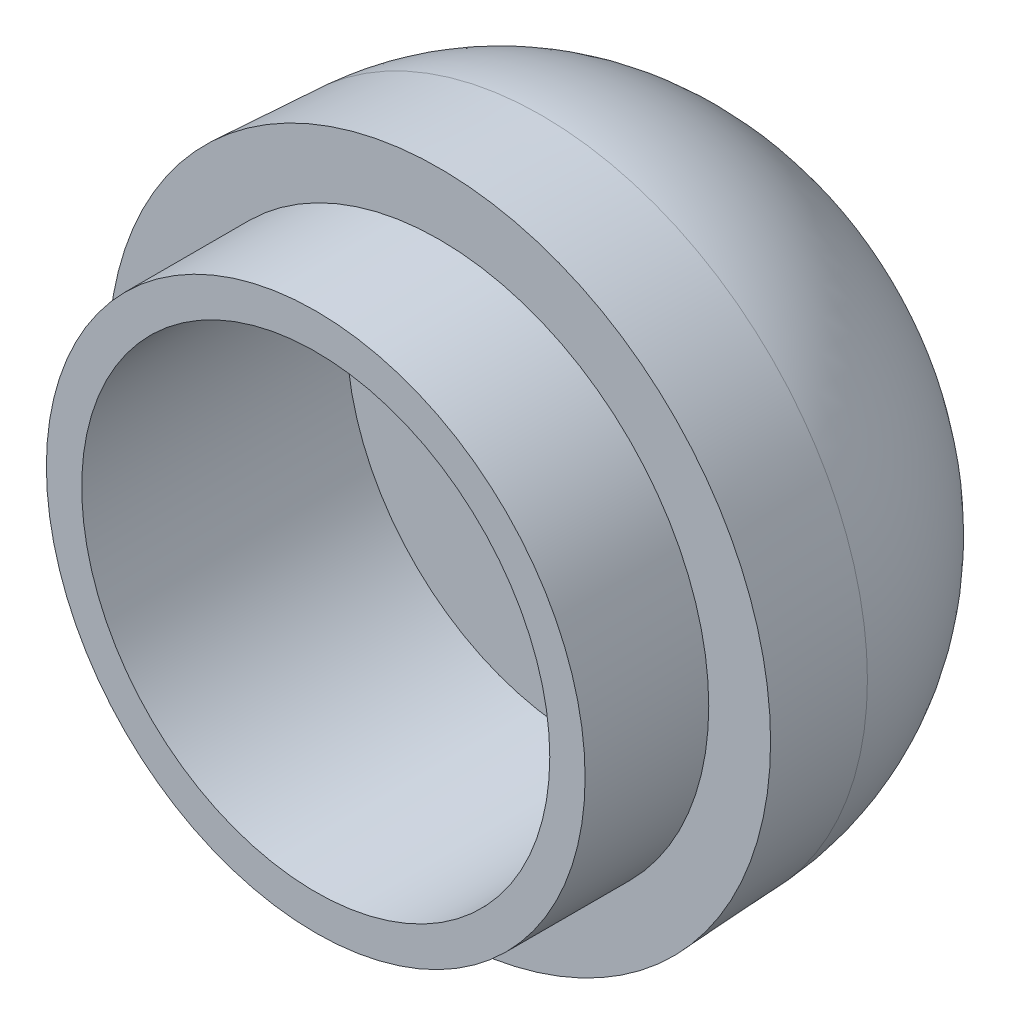
ISO-10303-21;
HEADER;
FILE_DESCRIPTION(('STEP AP214'),'2;1');
FILE_NAME('part.step','',(''),(''),'','','');
FILE_SCHEMA(('AUTOMOTIVE_DESIGN { 1 0 10303 214 1 1 1 1 }'));
ENDSEC;
DATA;
#1=APPLICATION_CONTEXT('core data for automotive mechanical design processes');
#2=APPLICATION_PROTOCOL_DEFINITION('international standard','automotive_design',2000,#1);
#3=PRODUCT_CONTEXT('',#1,'mechanical');
#4=PRODUCT('Part','Part','',(#3));
#5=PRODUCT_RELATED_PRODUCT_CATEGORY('part','',(#4));
#6=PRODUCT_DEFINITION_FORMATION('','',#4);
#7=PRODUCT_DEFINITION_CONTEXT('part definition',#1,'design');
#8=PRODUCT_DEFINITION('design','',#6,#7);
#9=PRODUCT_DEFINITION_SHAPE('','',#8);
#10=(LENGTH_UNIT() NAMED_UNIT(*) SI_UNIT(.MILLI.,.METRE.));
#11=(NAMED_UNIT(*) PLANE_ANGLE_UNIT() SI_UNIT($,.RADIAN.));
#12=(NAMED_UNIT(*) SI_UNIT($,.STERADIAN.) SOLID_ANGLE_UNIT());
#13=UNCERTAINTY_MEASURE_WITH_UNIT(LENGTH_MEASURE(1.E-05),#10,'distance_accuracy_value','');
#14=(GEOMETRIC_REPRESENTATION_CONTEXT(3) GLOBAL_UNCERTAINTY_ASSIGNED_CONTEXT((#13)) GLOBAL_UNIT_ASSIGNED_CONTEXT((#10,
#11,#12)) REPRESENTATION_CONTEXT('',''));
#15=CARTESIAN_POINT('',(0.,0.,0.));
#16=DIRECTION('',(0.,0.,1.));
#17=DIRECTION('',(1.,0.,0.));
#18=AXIS2_PLACEMENT_3D('',#15,#16,#17);
#19=CARTESIAN_POINT('',(0.,0.,0.));
#20=DIRECTION('',(0.,0.,1.));
#21=DIRECTION('',(1.,0.,0.));
#22=AXIS2_PLACEMENT_3D('',#19,#20,#21);
#23=PLANE('',#22);
#24=CARTESIAN_POINT('',(0.,0.,0.));
#25=DIRECTION('',(0.,0.,1.));
#26=DIRECTION('',(1.,0.,0.));
#27=AXIS2_PLACEMENT_3D('',#24,#25,#26);
#28=CIRCLE('',#27,4.7625);
#29=CARTESIAN_POINT('',(4.7625,0.,0.));
#30=VERTEX_POINT('',#29);
#31=EDGE_CURVE('E43',#30,#30,#28,.T.);
#32=ORIENTED_EDGE('',*,*,#31,.T.);
#33=EDGE_LOOP('',(#32));
#34=FACE_BOUND('',#33,.T.);
#35=CARTESIAN_POINT('',(0.,0.,0.));
#36=DIRECTION('',(0.,0.,1.));
#37=DIRECTION('',(1.,0.,0.));
#38=AXIS2_PLACEMENT_3D('',#35,#36,#37);
#39=CIRCLE('',#38,3.8735);
#40=CARTESIAN_POINT('',(3.8735,0.,0.));
#41=VERTEX_POINT('',#40);
#42=EDGE_CURVE('E50',#41,#41,#39,.T.);
#43=ORIENTED_EDGE('',*,*,#42,.F.);
#44=EDGE_LOOP('',(#43));
#45=FACE_BOUND('',#44,.T.);
#46=ADVANCED_FACE('F32',(#34,#45),#23,.T.);
#47=CARTESIAN_POINT('',(0.,0.,0.));
#48=DIRECTION('',(0.,0.,1.));
#49=DIRECTION('',(1.,0.,0.));
#50=AXIS2_PLACEMENT_3D('',#47,#48,#49);
#51=CONICAL_SURFACE('',#50,4.7625,0.05235987755983);
#52=CARTESIAN_POINT('',(0.,0.,-1.46939999328562));
#53=DIRECTION('',(0.,0.,1.));
#54=DIRECTION('',(1.,0.,0.));
#55=AXIS2_PLACEMENT_3D('',#52,#53,#54);
#56=CIRCLE('',#55,4.68549200947338);
#57=CARTESIAN_POINT('',(4.68549200947338,0.,-1.46939999328562));
#58=VERTEX_POINT('',#57);
#59=EDGE_CURVE('E39',#58,#58,#56,.T.);
#60=ORIENTED_EDGE('',*,*,#59,.T.);
#61=EDGE_LOOP('',(#60));
#62=FACE_BOUND('',#61,.T.);
#63=ORIENTED_EDGE('',*,*,#31,.F.);
#64=EDGE_LOOP('',(#63));
#65=FACE_BOUND('',#64,.T.);
#66=ADVANCED_FACE('F83',(#62,#65),#51,.T.);
#67=CARTESIAN_POINT('',(0.,0.,-5.08));
#68=DIRECTION('',(0.,0.,1.));
#69=DIRECTION('',(1.,0.,0.));
#70=AXIS2_PLACEMENT_3D('',#67,#68,#69);
#71=PLANE('',#70);
#72=CARTESIAN_POINT('',(0.,0.,-5.08));
#73=DIRECTION('',(0.,0.,1.));
#74=DIRECTION('',(1.,0.,0.));
#75=AXIS2_PLACEMENT_3D('',#72,#73,#74);
#76=CIRCLE('',#75,0.880713482058459);
#77=CARTESIAN_POINT('',(0.880713482058459,0.,-5.08));
#78=VERTEX_POINT('',#77);
#79=EDGE_CURVE('E10',#78,#78,#76,.F.);
#80=ORIENTED_EDGE('',*,*,#79,.T.);
#81=EDGE_LOOP('',(#80));
#82=FACE_BOUND('',#81,.T.);
#83=ADVANCED_FACE('F89',(#82),#71,.F.);
#84=CARTESIAN_POINT('',(0.,0.,-1.27));
#85=DIRECTION('',(0.,0.,1.));
#86=DIRECTION('',(1.,0.,0.));
#87=AXIS2_PLACEMENT_3D('',#84,#85,#86);
#88=DEGENERATE_TOROIDAL_SURFACE('',#87,0.880713482058459,3.81,.T.);
#89=ORIENTED_EDGE('',*,*,#79,.F.);
#90=EDGE_LOOP('',(#89));
#91=FACE_BOUND('',#90,.T.);
#92=ORIENTED_EDGE('',*,*,#59,.F.);
#93=EDGE_LOOP('',(#92));
#94=FACE_BOUND('',#93,.T.);
#95=ADVANCED_FACE('F34',(#91,#94),#88,.T.);
#96=CARTESIAN_POINT('',(0.,0.,1.778));
#97=DIRECTION('',(0.,0.,-1.));
#98=DIRECTION('',(-1.,0.,0.));
#99=AXIS2_PLACEMENT_3D('',#96,#97,#98);
#100=CYLINDRICAL_SURFACE('',#99,3.8735);
#101=CARTESIAN_POINT('',(0.,0.,1.778));
#102=DIRECTION('',(0.,0.,1.));
#103=DIRECTION('',(1.,0.,0.));
#104=AXIS2_PLACEMENT_3D('',#101,#102,#103);
#105=CIRCLE('',#104,3.8735);
#106=CARTESIAN_POINT('',(3.8735,0.,1.778));
#107=VERTEX_POINT('',#106);
#108=EDGE_CURVE('E47',#107,#107,#105,.T.);
#109=ORIENTED_EDGE('',*,*,#108,.F.);
#110=EDGE_LOOP('',(#109));
#111=FACE_BOUND('',#110,.T.);
#112=ORIENTED_EDGE('',*,*,#42,.T.);
#113=EDGE_LOOP('',(#112));
#114=FACE_BOUND('',#113,.T.);
#115=ADVANCED_FACE('F73',(#111,#114),#100,.T.);
#116=CARTESIAN_POINT('',(0.,0.,1.778));
#117=DIRECTION('',(0.,0.,1.));
#118=DIRECTION('',(1.,0.,0.));
#119=AXIS2_PLACEMENT_3D('',#116,#117,#118);
#120=PLANE('',#119);
#121=CARTESIAN_POINT('',(0.,0.,1.778));
#122=DIRECTION('',(0.,0.,1.));
#123=DIRECTION('',(1.,0.,0.));
#124=AXIS2_PLACEMENT_3D('',#121,#122,#123);
#125=CIRCLE('',#124,3.3655);
#126=CARTESIAN_POINT('',(3.3655,0.,1.778));
#127=VERTEX_POINT('',#126);
#128=EDGE_CURVE('E56',#127,#127,#125,.T.);
#129=ORIENTED_EDGE('',*,*,#128,.F.);
#130=EDGE_LOOP('',(#129));
#131=FACE_BOUND('',#130,.T.);
#132=ORIENTED_EDGE('',*,*,#108,.T.);
#133=EDGE_LOOP('',(#132));
#134=FACE_BOUND('',#133,.T.);
#135=ADVANCED_FACE('F67',(#131,#134),#120,.T.);
#136=CARTESIAN_POINT('',(0.,0.,-2.032));
#137=DIRECTION('',(0.,0.,1.));
#138=DIRECTION('',(1.,0.,0.));
#139=AXIS2_PLACEMENT_3D('',#136,#137,#138);
#140=CYLINDRICAL_SURFACE('',#139,3.3655);
#141=CARTESIAN_POINT('',(0.,0.,-2.032));
#142=DIRECTION('',(0.,0.,1.));
#143=DIRECTION('',(1.,0.,0.));
#144=AXIS2_PLACEMENT_3D('',#141,#142,#143);
#145=CIRCLE('',#144,3.3655);
#146=CARTESIAN_POINT('',(3.3655,0.,-2.032));
#147=VERTEX_POINT('',#146);
#148=EDGE_CURVE('E53',#147,#147,#145,.T.);
#149=CARTESIAN_POINT('',(3.3655,0.,-2.032));
#150=CARTESIAN_POINT('',(3.3655,0.,-1.9923125));
#151=CARTESIAN_POINT('',(3.3655,0.,-1.952625));
#152=CARTESIAN_POINT('',(3.3655,0.,-1.87325));
#153=CARTESIAN_POINT('',(3.3655,0.,-1.8335625));
#154=CARTESIAN_POINT('',(3.3655,0.,-1.7541875));
#155=CARTESIAN_POINT('',(3.3655,0.,-1.7145));
#156=CARTESIAN_POINT('',(3.3655,0.,-1.635125));
#157=CARTESIAN_POINT('',(3.3655,0.,-1.5954375));
#158=CARTESIAN_POINT('',(3.3655,0.,-1.5160625));
#159=CARTESIAN_POINT('',(3.3655,0.,-1.476375));
#160=CARTESIAN_POINT('',(3.3655,0.,-1.397));
#161=CARTESIAN_POINT('',(3.3655,0.,-1.3573125));
#162=CARTESIAN_POINT('',(3.3655,0.,-1.2779375));
#163=CARTESIAN_POINT('',(3.3655,0.,-1.23825));
#164=CARTESIAN_POINT('',(3.3655,0.,-1.158875));
#165=CARTESIAN_POINT('',(3.3655,0.,-1.1191875));
#166=CARTESIAN_POINT('',(3.3655,0.,-1.0398125));
#167=CARTESIAN_POINT('',(3.3655,0.,-1.000125));
#168=CARTESIAN_POINT('',(3.3655,0.,-0.92075));
#169=CARTESIAN_POINT('',(3.3655,0.,-0.8810625));
#170=CARTESIAN_POINT('',(3.3655,0.,-0.8016875));
#171=CARTESIAN_POINT('',(3.3655,0.,-0.762));
#172=CARTESIAN_POINT('',(3.3655,0.,-0.682625));
#173=CARTESIAN_POINT('',(3.3655,0.,-0.6429375));
#174=CARTESIAN_POINT('',(3.3655,0.,-0.5635625));
#175=CARTESIAN_POINT('',(3.3655,0.,-0.523875));
#176=CARTESIAN_POINT('',(3.3655,0.,-0.4445));
#177=CARTESIAN_POINT('',(3.3655,0.,-0.4048125));
#178=CARTESIAN_POINT('',(3.3655,0.,-0.3254375));
#179=CARTESIAN_POINT('',(3.3655,0.,-0.28575));
#180=CARTESIAN_POINT('',(3.3655,0.,-0.206375));
#181=CARTESIAN_POINT('',(3.3655,0.,-0.1666875));
#182=CARTESIAN_POINT('',(3.3655,0.,-0.0873124999999999));
#183=CARTESIAN_POINT('',(3.3655,0.,-0.047625));
#184=CARTESIAN_POINT('',(3.3655,0.,0.0317499999999998));
#185=CARTESIAN_POINT('',(3.3655,0.,0.0714374999999998));
#186=CARTESIAN_POINT('',(3.3655,0.,0.1508125));
#187=CARTESIAN_POINT('',(3.3655,0.,0.1905));
#188=CARTESIAN_POINT('',(3.3655,0.,0.269875));
#189=CARTESIAN_POINT('',(3.3655,0.,0.3095625));
#190=CARTESIAN_POINT('',(3.3655,0.,0.3889375));
#191=CARTESIAN_POINT('',(3.3655,0.,0.428625));
#192=CARTESIAN_POINT('',(3.3655,0.,0.508));
#193=CARTESIAN_POINT('',(3.3655,0.,0.5476875));
#194=CARTESIAN_POINT('',(3.3655,0.,0.6270625));
#195=CARTESIAN_POINT('',(3.3655,0.,0.66675));
#196=CARTESIAN_POINT('',(3.3655,0.,0.746125));
#197=CARTESIAN_POINT('',(3.3655,0.,0.7858125));
#198=CARTESIAN_POINT('',(3.3655,0.,0.8651875));
#199=CARTESIAN_POINT('',(3.3655,0.,0.904875));
#200=CARTESIAN_POINT('',(3.3655,0.,0.98425));
#201=CARTESIAN_POINT('',(3.3655,0.,1.0239375));
#202=CARTESIAN_POINT('',(3.3655,0.,1.1033125));
#203=CARTESIAN_POINT('',(3.3655,0.,1.143));
#204=CARTESIAN_POINT('',(3.3655,0.,1.222375));
#205=CARTESIAN_POINT('',(3.3655,0.,1.2620625));
#206=CARTESIAN_POINT('',(3.3655,0.,1.3414375));
#207=CARTESIAN_POINT('',(3.3655,0.,1.381125));
#208=CARTESIAN_POINT('',(3.3655,0.,1.4605));
#209=CARTESIAN_POINT('',(3.3655,0.,1.5001875));
#210=CARTESIAN_POINT('',(3.3655,0.,1.5795625));
#211=CARTESIAN_POINT('',(3.3655,0.,1.61925));
#212=CARTESIAN_POINT('',(3.3655,0.,1.698625));
#213=CARTESIAN_POINT('',(3.3655,0.,1.7383125));
#214=CARTESIAN_POINT('',(3.3655,0.,1.778));
#215=B_SPLINE_CURVE_WITH_KNOTS('',3,(#149,#150,#151,#152,#153,#154,#155,#156,#157,#158,#159,
#160,#161,#162,#163,#164,#165,#166,#167,#168,#169,#170,#171,#172,#173,#174,#175,#176,#177,#178,
#179,#180,#181,#182,#183,#184,#185,#186,#187,#188,#189,#190,#191,#192,#193,#194,#195,#196,#197,
#198,#199,#200,#201,#202,#203,#204,#205,#206,#207,#208,#209,#210,#211,#212,#213,#214),
.UNSPECIFIED.,.F.,.F.,(4,2,2,2,2,2,2,2,2,2,2,2,2,2,2,2,2,2,2,2,2,2,2,2,2,2,2,2,2,2,2,2,4),(0.,
0.1190625,0.238125,0.3571875,0.47625,0.5953125,0.714375,0.8334375,0.9525,1.0715625,1.190625,
1.3096875,1.42875,1.5478125,1.666875,1.7859375,1.905,2.0240625,2.143125,2.2621875,2.38125,
2.5003125,2.619375,2.7384375,2.8575,2.9765625,3.095625,3.2146875,3.33375,3.4528125,3.571875,
3.6909375,3.81),.UNSPECIFIED.);
#216=EDGE_CURVE('BSEAM64',#147,#127,#215,.T.);
#217=ORIENTED_EDGE('',*,*,#148,.F.);
#218=ORIENTED_EDGE('',*,*,#128,.T.);
#219=ORIENTED_EDGE('',*,*,#216,.T.);
#220=ORIENTED_EDGE('',*,*,#216,.F.);
#221=EDGE_LOOP('',(#217,#219,#218,#220));
#222=FACE_BOUND('',#221,.T.);
#223=ADVANCED_FACE('F64',(#222),#140,.F.);
#224=CARTESIAN_POINT('',(0.,0.,-2.032));
#225=DIRECTION('',(0.,0.,1.));
#226=DIRECTION('',(1.,0.,0.));
#227=AXIS2_PLACEMENT_3D('',#224,#225,#226);
#228=PLANE('',#227);
#229=ORIENTED_EDGE('',*,*,#148,.T.);
#230=EDGE_LOOP('',(#229));
#231=FACE_BOUND('',#230,.T.);
#232=ADVANCED_FACE('F62',(#231),#228,.T.);
#233=CLOSED_SHELL('',(#46,#66,#83,#95,#115,#135,#223,#232));
#234=MANIFOLD_SOLID_BREP('B2',#233);
#235=ADVANCED_BREP_SHAPE_REPRESENTATION('',(#18,#234),#14);
#236=SHAPE_DEFINITION_REPRESENTATION(#9,#235);
ENDSEC;
END-ISO-10303-21;
